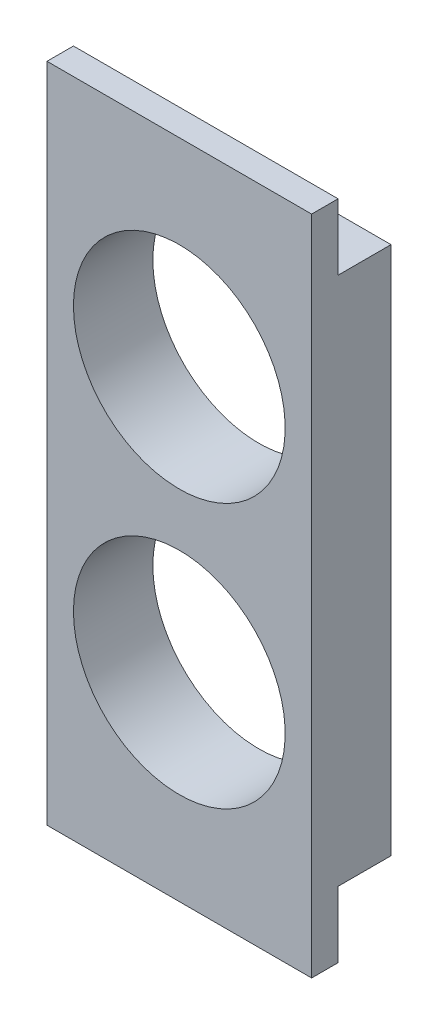
ISO-10303-21;
HEADER;
FILE_DESCRIPTION(('STEP AP214'),'2;1');
FILE_NAME('part.step','',(''),(''),'','','');
FILE_SCHEMA(('AUTOMOTIVE_DESIGN { 1 0 10303 214 1 1 1 1 }'));
ENDSEC;
DATA;
#1=APPLICATION_CONTEXT('core data for automotive mechanical design processes');
#2=APPLICATION_PROTOCOL_DEFINITION('international standard','automotive_design',2000,#1);
#3=PRODUCT_CONTEXT('',#1,'mechanical');
#4=PRODUCT('Part','Part','',(#3));
#5=PRODUCT_RELATED_PRODUCT_CATEGORY('part','',(#4));
#6=PRODUCT_DEFINITION_FORMATION('','',#4);
#7=PRODUCT_DEFINITION_CONTEXT('part definition',#1,'design');
#8=PRODUCT_DEFINITION('design','',#6,#7);
#9=PRODUCT_DEFINITION_SHAPE('','',#8);
#10=(LENGTH_UNIT() NAMED_UNIT(*) SI_UNIT(.MILLI.,.METRE.));
#11=(NAMED_UNIT(*) PLANE_ANGLE_UNIT() SI_UNIT($,.RADIAN.));
#12=(NAMED_UNIT(*) SI_UNIT($,.STERADIAN.) SOLID_ANGLE_UNIT());
#13=UNCERTAINTY_MEASURE_WITH_UNIT(LENGTH_MEASURE(1.E-05),#10,'distance_accuracy_value','');
#14=(GEOMETRIC_REPRESENTATION_CONTEXT(3) GLOBAL_UNCERTAINTY_ASSIGNED_CONTEXT((#13)) GLOBAL_UNIT_ASSIGNED_CONTEXT((#10,
#11,#12)) REPRESENTATION_CONTEXT('',''));
#15=CARTESIAN_POINT('',(0.,0.,0.));
#16=DIRECTION('',(0.,0.,1.));
#17=DIRECTION('',(1.,0.,0.));
#18=AXIS2_PLACEMENT_3D('',#15,#16,#17);
#19=CARTESIAN_POINT('',(0.,0.,0.));
#20=DIRECTION('',(0.,0.,1.));
#21=DIRECTION('',(1.,0.,0.));
#22=AXIS2_PLACEMENT_3D('',#19,#20,#21);
#23=PLANE('',#22);
#24=DIRECTION('',(0.,-1.,0.));
#25=VECTOR('',#24,1.);
#26=CARTESIAN_POINT('',(-50.,-100.,0.));
#27=LINE('',#26,#25);
#28=CARTESIAN_POINT('',(-50.,100.,0.));
#29=VERTEX_POINT('',#28);
#30=CARTESIAN_POINT('',(-50.,-100.,0.));
#31=VERTEX_POINT('',#30);
#32=EDGE_CURVE('E154',#29,#31,#27,.T.);
#33=ORIENTED_EDGE('',*,*,#32,.F.);
#34=DIRECTION('',(-1.,0.,0.));
#35=VECTOR('',#34,1.);
#36=CARTESIAN_POINT('',(50.,100.,0.));
#37=LINE('',#36,#35);
#38=CARTESIAN_POINT('',(50.,100.,0.));
#39=VERTEX_POINT('',#38);
#40=EDGE_CURVE('E78',#39,#29,#37,.T.);
#41=ORIENTED_EDGE('',*,*,#40,.F.);
#42=DIRECTION('',(0.,1.,0.));
#43=VECTOR('',#42,1.);
#44=CARTESIAN_POINT('',(50.,-100.,0.));
#45=LINE('',#44,#43);
#46=CARTESIAN_POINT('',(50.,-100.,0.));
#47=VERTEX_POINT('',#46);
#48=EDGE_CURVE('E73',#47,#39,#45,.T.);
#49=ORIENTED_EDGE('',*,*,#48,.F.);
#50=DIRECTION('',(1.,0.,0.));
#51=VECTOR('',#50,1.);
#52=CARTESIAN_POINT('',(50.,-100.,0.));
#53=LINE('',#52,#51);
#54=EDGE_CURVE('E164',#31,#47,#53,.T.);
#55=ORIENTED_EDGE('',*,*,#54,.F.);
#56=EDGE_LOOP('',(#33,#41,#49,#55));
#57=FACE_BOUND('',#56,.T.);
#58=CARTESIAN_POINT('',(0.,50.,0.));
#59=DIRECTION('',(0.,0.,1.));
#60=DIRECTION('',(1.,0.,0.));
#61=AXIS2_PLACEMENT_3D('',#58,#59,#60);
#62=CIRCLE('',#61,40.);
#63=CARTESIAN_POINT('',(40.,50.,0.));
#64=VERTEX_POINT('',#63);
#65=EDGE_CURVE('E145',#64,#64,#62,.T.);
#66=ORIENTED_EDGE('',*,*,#65,.T.);
#67=EDGE_LOOP('',(#66));
#68=FACE_BOUND('',#67,.T.);
#69=CARTESIAN_POINT('',(0.,-50.,0.));
#70=DIRECTION('',(0.,0.,1.));
#71=DIRECTION('',(-1.,0.,0.));
#72=AXIS2_PLACEMENT_3D('',#69,#70,#71);
#73=CIRCLE('',#72,40.);
#74=CARTESIAN_POINT('',(-40.,-50.,0.));
#75=VERTEX_POINT('',#74);
#76=EDGE_CURVE('E140',#75,#75,#73,.T.);
#77=ORIENTED_EDGE('',*,*,#76,.T.);
#78=EDGE_LOOP('',(#77));
#79=FACE_BOUND('',#78,.T.);
#80=ADVANCED_FACE('F39',(#57,#68,#79),#23,.F.);
#81=CARTESIAN_POINT('',(-50.,-100.,20.));
#82=DIRECTION('',(1.,0.,0.));
#83=DIRECTION('',(0.,0.,-1.));
#84=AXIS2_PLACEMENT_3D('',#81,#82,#83);
#85=PLANE('',#84);
#86=ORIENTED_EDGE('',*,*,#32,.T.);
#87=DIRECTION('',(0.,0.,-1.));
#88=VECTOR('',#87,1.);
#89=CARTESIAN_POINT('',(-50.,-100.,20.));
#90=LINE('',#89,#88);
#91=CARTESIAN_POINT('',(-50.,-100.,20.));
#92=VERTEX_POINT('',#91);
#93=EDGE_CURVE('E11',#92,#31,#90,.T.);
#94=ORIENTED_EDGE('',*,*,#93,.F.);
#95=DIRECTION('',(0.,-1.,0.));
#96=VECTOR('',#95,1.);
#97=CARTESIAN_POINT('',(-50.,-125.,20.));
#98=LINE('',#97,#96);
#99=CARTESIAN_POINT('',(-50.,-125.,20.));
#100=VERTEX_POINT('',#99);
#101=EDGE_CURVE('E137',#92,#100,#98,.T.);
#102=ORIENTED_EDGE('',*,*,#101,.T.);
#103=DIRECTION('',(0.,0.,-1.));
#104=VECTOR('',#103,1.);
#105=CARTESIAN_POINT('',(-50.,-125.,30.));
#106=LINE('',#105,#104);
#107=CARTESIAN_POINT('',(-50.,-125.,30.));
#108=VERTEX_POINT('',#107);
#109=EDGE_CURVE('E116',#108,#100,#106,.T.);
#110=ORIENTED_EDGE('',*,*,#109,.F.);
#111=DIRECTION('',(0.,-1.,0.));
#112=VECTOR('',#111,1.);
#113=CARTESIAN_POINT('',(-50.,-125.,30.));
#114=LINE('',#113,#112);
#115=CARTESIAN_POINT('',(-50.,125.,30.));
#116=VERTEX_POINT('',#115);
#117=EDGE_CURVE('E123',#116,#108,#114,.T.);
#118=ORIENTED_EDGE('',*,*,#117,.F.);
#119=DIRECTION('',(0.,0.,-1.));
#120=VECTOR('',#119,1.);
#121=CARTESIAN_POINT('',(-50.,125.,30.));
#122=LINE('',#121,#120);
#123=CARTESIAN_POINT('',(-50.,125.,20.));
#124=VERTEX_POINT('',#123);
#125=EDGE_CURVE('E203',#116,#124,#122,.T.);
#126=ORIENTED_EDGE('',*,*,#125,.T.);
#127=CARTESIAN_POINT('',(-50.,100.,20.));
#128=VERTEX_POINT('',#127);
#129=EDGE_CURVE('E184',#124,#128,#98,.T.);
#130=ORIENTED_EDGE('',*,*,#129,.T.);
#131=DIRECTION('',(0.,0.,-1.));
#132=VECTOR('',#131,1.);
#133=CARTESIAN_POINT('',(-50.,100.,20.));
#134=LINE('',#133,#132);
#135=EDGE_CURVE('E161',#128,#29,#134,.T.);
#136=ORIENTED_EDGE('',*,*,#135,.T.);
#137=EDGE_LOOP('',(#86,#94,#102,#110,#118,#126,#130,#136));
#138=FACE_BOUND('',#137,.T.);
#139=ADVANCED_FACE('F41',(#138),#85,.F.);
#140=CARTESIAN_POINT('',(50.,-100.,20.));
#141=DIRECTION('',(0.,1.,0.));
#142=DIRECTION('',(0.,0.,1.));
#143=AXIS2_PLACEMENT_3D('',#140,#141,#142);
#144=PLANE('',#143);
#145=ORIENTED_EDGE('',*,*,#54,.T.);
#146=DIRECTION('',(0.,0.,-1.));
#147=VECTOR('',#146,1.);
#148=CARTESIAN_POINT('',(50.,-100.,20.));
#149=LINE('',#148,#147);
#150=CARTESIAN_POINT('',(50.,-100.,20.));
#151=VERTEX_POINT('',#150);
#152=EDGE_CURVE('E49',#151,#47,#149,.T.);
#153=ORIENTED_EDGE('',*,*,#152,.F.);
#154=DIRECTION('',(1.,0.,0.));
#155=VECTOR('',#154,1.);
#156=CARTESIAN_POINT('',(50.,-100.,20.));
#157=LINE('',#156,#155);
#158=EDGE_CURVE('E83',#92,#151,#157,.T.);
#159=ORIENTED_EDGE('',*,*,#158,.F.);
#160=ORIENTED_EDGE('',*,*,#93,.T.);
#161=EDGE_LOOP('',(#145,#153,#159,#160));
#162=FACE_BOUND('',#161,.T.);
#163=ADVANCED_FACE('F247',(#162),#144,.F.);
#164=CARTESIAN_POINT('',(50.,-100.,20.));
#165=DIRECTION('',(-1.,0.,0.));
#166=DIRECTION('',(0.,0.,1.));
#167=AXIS2_PLACEMENT_3D('',#164,#165,#166);
#168=PLANE('',#167);
#169=ORIENTED_EDGE('',*,*,#48,.T.);
#170=DIRECTION('',(0.,0.,-1.));
#171=VECTOR('',#170,1.);
#172=CARTESIAN_POINT('',(50.,100.,20.));
#173=LINE('',#172,#171);
#174=CARTESIAN_POINT('',(50.,100.,20.));
#175=VERTEX_POINT('',#174);
#176=EDGE_CURVE('E57',#175,#39,#173,.T.);
#177=ORIENTED_EDGE('',*,*,#176,.F.);
#178=DIRECTION('',(0.,1.,0.));
#179=VECTOR('',#178,1.);
#180=CARTESIAN_POINT('',(50.,-125.,20.));
#181=LINE('',#180,#179);
#182=CARTESIAN_POINT('',(50.,125.,20.));
#183=VERTEX_POINT('',#182);
#184=EDGE_CURVE('E190',#175,#183,#181,.T.);
#185=ORIENTED_EDGE('',*,*,#184,.T.);
#186=DIRECTION('',(0.,0.,-1.));
#187=VECTOR('',#186,1.);
#188=CARTESIAN_POINT('',(50.,125.,30.));
#189=LINE('',#188,#187);
#190=CARTESIAN_POINT('',(50.,125.,30.));
#191=VERTEX_POINT('',#190);
#192=EDGE_CURVE('E147',#191,#183,#189,.T.);
#193=ORIENTED_EDGE('',*,*,#192,.F.);
#194=DIRECTION('',(0.,1.,0.));
#195=VECTOR('',#194,1.);
#196=CARTESIAN_POINT('',(50.,-125.,30.));
#197=LINE('',#196,#195);
#198=CARTESIAN_POINT('',(50.,-125.,30.));
#199=VERTEX_POINT('',#198);
#200=EDGE_CURVE('E122',#199,#191,#197,.T.);
#201=ORIENTED_EDGE('',*,*,#200,.F.);
#202=DIRECTION('',(0.,0.,-1.));
#203=VECTOR('',#202,1.);
#204=CARTESIAN_POINT('',(50.,-125.,30.));
#205=LINE('',#204,#203);
#206=CARTESIAN_POINT('',(50.,-125.,20.));
#207=VERTEX_POINT('',#206);
#208=EDGE_CURVE('E118',#199,#207,#205,.T.);
#209=ORIENTED_EDGE('',*,*,#208,.T.);
#210=EDGE_CURVE('E178',#207,#151,#181,.T.);
#211=ORIENTED_EDGE('',*,*,#210,.T.);
#212=ORIENTED_EDGE('',*,*,#152,.T.);
#213=EDGE_LOOP('',(#169,#177,#185,#193,#201,#209,#211,#212));
#214=FACE_BOUND('',#213,.T.);
#215=ADVANCED_FACE('F176',(#214),#168,.F.);
#216=CARTESIAN_POINT('',(50.,100.,20.));
#217=DIRECTION('',(0.,-1.,0.));
#218=DIRECTION('',(1.,0.,0.));
#219=AXIS2_PLACEMENT_3D('',#216,#217,#218);
#220=PLANE('',#219);
#221=ORIENTED_EDGE('',*,*,#40,.T.);
#222=ORIENTED_EDGE('',*,*,#135,.F.);
#223=DIRECTION('',(-1.,0.,0.));
#224=VECTOR('',#223,1.);
#225=CARTESIAN_POINT('',(50.,100.,20.));
#226=LINE('',#225,#224);
#227=EDGE_CURVE('E157',#175,#128,#226,.T.);
#228=ORIENTED_EDGE('',*,*,#227,.F.);
#229=ORIENTED_EDGE('',*,*,#176,.T.);
#230=EDGE_LOOP('',(#221,#222,#228,#229));
#231=FACE_BOUND('',#230,.T.);
#232=ADVANCED_FACE('F185',(#231),#220,.F.);
#233=CARTESIAN_POINT('',(0.,50.,20.));
#234=DIRECTION('',(0.,0.,-1.));
#235=DIRECTION('',(-1.,0.,0.));
#236=AXIS2_PLACEMENT_3D('',#233,#234,#235);
#237=CYLINDRICAL_SURFACE('',#236,40.);
#238=ORIENTED_EDGE('',*,*,#65,.F.);
#239=EDGE_LOOP('',(#238));
#240=FACE_BOUND('',#239,.T.);
#241=CARTESIAN_POINT('',(0.,50.,30.));
#242=DIRECTION('',(0.,0.,-1.));
#243=DIRECTION('',(-1.,0.,0.));
#244=AXIS2_PLACEMENT_3D('',#241,#242,#243);
#245=CIRCLE('',#244,40.);
#246=CARTESIAN_POINT('',(-40.,50.,30.));
#247=VERTEX_POINT('',#246);
#248=EDGE_CURVE('E214',#247,#247,#245,.T.);
#249=ORIENTED_EDGE('',*,*,#248,.F.);
#250=EDGE_LOOP('',(#249));
#251=FACE_BOUND('',#250,.T.);
#252=ADVANCED_FACE('F229',(#240,#251),#237,.F.);
#253=CARTESIAN_POINT('',(0.,-50.,20.));
#254=DIRECTION('',(0.,0.,-1.));
#255=DIRECTION('',(-1.,0.,0.));
#256=AXIS2_PLACEMENT_3D('',#253,#254,#255);
#257=CYLINDRICAL_SURFACE('',#256,40.);
#258=ORIENTED_EDGE('',*,*,#76,.F.);
#259=EDGE_LOOP('',(#258));
#260=FACE_BOUND('',#259,.T.);
#261=CARTESIAN_POINT('',(0.,-50.,30.));
#262=DIRECTION('',(0.,0.,-1.));
#263=DIRECTION('',(-1.,0.,0.));
#264=AXIS2_PLACEMENT_3D('',#261,#262,#263);
#265=CIRCLE('',#264,40.);
#266=CARTESIAN_POINT('',(-40.,-50.,30.));
#267=VERTEX_POINT('',#266);
#268=EDGE_CURVE('E217',#267,#267,#265,.T.);
#269=ORIENTED_EDGE('',*,*,#268,.F.);
#270=EDGE_LOOP('',(#269));
#271=FACE_BOUND('',#270,.T.);
#272=ADVANCED_FACE('F227',(#260,#271),#257,.F.);
#273=CARTESIAN_POINT('',(0.,0.,20.));
#274=DIRECTION('',(0.,0.,1.));
#275=DIRECTION('',(1.,0.,0.));
#276=AXIS2_PLACEMENT_3D('',#273,#274,#275);
#277=PLANE('',#276);
#278=ORIENTED_EDGE('',*,*,#184,.F.);
#279=ORIENTED_EDGE('',*,*,#227,.T.);
#280=ORIENTED_EDGE('',*,*,#129,.F.);
#281=DIRECTION('',(-1.,0.,0.));
#282=VECTOR('',#281,1.);
#283=CARTESIAN_POINT('',(50.,125.,20.));
#284=LINE('',#283,#282);
#285=EDGE_CURVE('E133',#183,#124,#284,.T.);
#286=ORIENTED_EDGE('',*,*,#285,.F.);
#287=EDGE_LOOP('',(#278,#279,#280,#286));
#288=FACE_BOUND('',#287,.T.);
#289=ADVANCED_FACE('F188',(#288),#277,.F.);
#290=CARTESIAN_POINT('',(0.,0.,30.));
#291=DIRECTION('',(0.,0.,1.));
#292=DIRECTION('',(1.,0.,0.));
#293=AXIS2_PLACEMENT_3D('',#290,#291,#292);
#294=PLANE('',#293);
#295=ORIENTED_EDGE('',*,*,#248,.T.);
#296=EDGE_LOOP('',(#295));
#297=FACE_BOUND('',#296,.T.);
#298=ORIENTED_EDGE('',*,*,#268,.T.);
#299=EDGE_LOOP('',(#298));
#300=FACE_BOUND('',#299,.T.);
#301=ORIENTED_EDGE('',*,*,#117,.T.);
#302=DIRECTION('',(1.,0.,0.));
#303=VECTOR('',#302,1.);
#304=CARTESIAN_POINT('',(50.,-125.,30.));
#305=LINE('',#304,#303);
#306=EDGE_CURVE('E112',#108,#199,#305,.T.);
#307=ORIENTED_EDGE('',*,*,#306,.T.);
#308=ORIENTED_EDGE('',*,*,#200,.T.);
#309=DIRECTION('',(-1.,0.,0.));
#310=VECTOR('',#309,1.);
#311=CARTESIAN_POINT('',(50.,125.,30.));
#312=LINE('',#311,#310);
#313=EDGE_CURVE('E128',#191,#116,#312,.T.);
#314=ORIENTED_EDGE('',*,*,#313,.T.);
#315=EDGE_LOOP('',(#301,#307,#308,#314));
#316=FACE_BOUND('',#315,.T.);
#317=ADVANCED_FACE('F126',(#297,#300,#316),#294,.T.);
#318=CARTESIAN_POINT('',(50.,125.,30.));
#319=DIRECTION('',(0.,-1.,0.));
#320=DIRECTION('',(0.,0.,-1.));
#321=AXIS2_PLACEMENT_3D('',#318,#319,#320);
#322=PLANE('',#321);
#323=ORIENTED_EDGE('',*,*,#285,.T.);
#324=ORIENTED_EDGE('',*,*,#125,.F.);
#325=ORIENTED_EDGE('',*,*,#313,.F.);
#326=ORIENTED_EDGE('',*,*,#192,.T.);
#327=EDGE_LOOP('',(#323,#324,#325,#326));
#328=FACE_BOUND('',#327,.T.);
#329=ADVANCED_FACE('F207',(#328),#322,.F.);
#330=CARTESIAN_POINT('',(50.,-125.,30.));
#331=DIRECTION('',(0.,1.,0.));
#332=DIRECTION('',(0.,0.,1.));
#333=AXIS2_PLACEMENT_3D('',#330,#331,#332);
#334=PLANE('',#333);
#335=DIRECTION('',(1.,0.,0.));
#336=VECTOR('',#335,1.);
#337=CARTESIAN_POINT('',(50.,-125.,20.));
#338=LINE('',#337,#336);
#339=EDGE_CURVE('E194',#100,#207,#338,.T.);
#340=ORIENTED_EDGE('',*,*,#339,.T.);
#341=ORIENTED_EDGE('',*,*,#208,.F.);
#342=ORIENTED_EDGE('',*,*,#306,.F.);
#343=ORIENTED_EDGE('',*,*,#109,.T.);
#344=EDGE_LOOP('',(#340,#341,#342,#343));
#345=FACE_BOUND('',#344,.T.);
#346=ADVANCED_FACE('F114',(#345),#334,.F.);
#347=ORIENTED_EDGE('',*,*,#101,.F.);
#348=ORIENTED_EDGE('',*,*,#158,.T.);
#349=ORIENTED_EDGE('',*,*,#210,.F.);
#350=ORIENTED_EDGE('',*,*,#339,.F.);
#351=EDGE_LOOP('',(#347,#348,#349,#350));
#352=FACE_BOUND('',#351,.T.);
#353=ADVANCED_FACE('F237',(#352),#277,.F.);
#354=CLOSED_SHELL('',(#80,#139,#163,#215,#232,#252,#272,#289,#317,#329,#346,#353));
#355=MANIFOLD_SOLID_BREP('B2',#354);
#356=ADVANCED_BREP_SHAPE_REPRESENTATION('',(#18,#355),#14);
#357=SHAPE_DEFINITION_REPRESENTATION(#9,#356);
ENDSEC;
END-ISO-10303-21;
